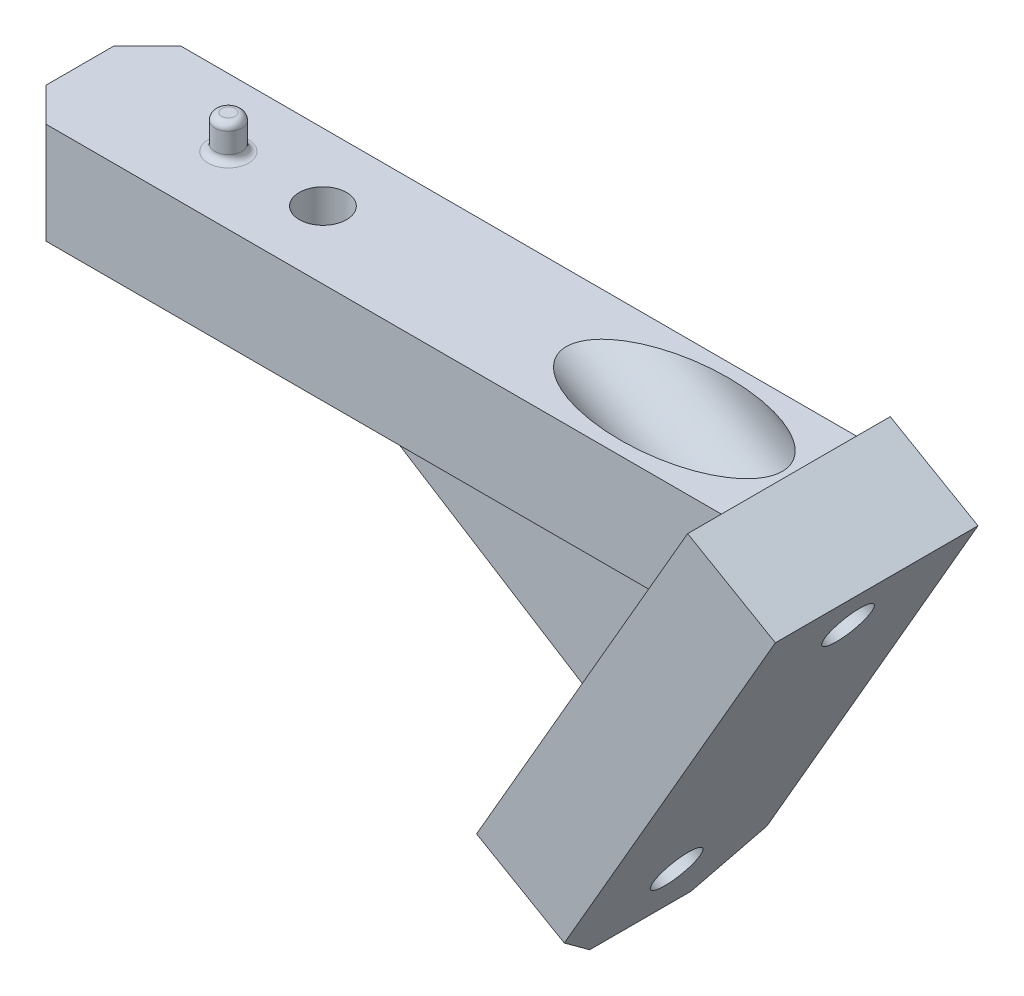
ISO-10303-21;
HEADER;
FILE_DESCRIPTION(('STEP AP214'),'2;1');
FILE_NAME('part.step','',(''),(''),'','','');
FILE_SCHEMA(('AUTOMOTIVE_DESIGN { 1 0 10303 214 1 1 1 1 }'));
ENDSEC;
DATA;
#1=APPLICATION_CONTEXT('core data for automotive mechanical design processes');
#2=APPLICATION_PROTOCOL_DEFINITION('international standard','automotive_design',2000,#1);
#3=PRODUCT_CONTEXT('',#1,'mechanical');
#4=PRODUCT('Part','Part','',(#3));
#5=PRODUCT_RELATED_PRODUCT_CATEGORY('part','',(#4));
#6=PRODUCT_DEFINITION_FORMATION('','',#4);
#7=PRODUCT_DEFINITION_CONTEXT('part definition',#1,'design');
#8=PRODUCT_DEFINITION('design','',#6,#7);
#9=PRODUCT_DEFINITION_SHAPE('','',#8);
#10=(LENGTH_UNIT() NAMED_UNIT(*) SI_UNIT(.MILLI.,.METRE.));
#11=(NAMED_UNIT(*) PLANE_ANGLE_UNIT() SI_UNIT($,.RADIAN.));
#12=(NAMED_UNIT(*) SI_UNIT($,.STERADIAN.) SOLID_ANGLE_UNIT());
#13=UNCERTAINTY_MEASURE_WITH_UNIT(LENGTH_MEASURE(1.E-05),#10,'distance_accuracy_value','');
#14=(GEOMETRIC_REPRESENTATION_CONTEXT(3) GLOBAL_UNCERTAINTY_ASSIGNED_CONTEXT((#13)) GLOBAL_UNIT_ASSIGNED_CONTEXT((#10,
#11,#12)) REPRESENTATION_CONTEXT('',''));
#15=CARTESIAN_POINT('',(0.,0.,0.));
#16=DIRECTION('',(0.,0.,1.));
#17=DIRECTION('',(1.,0.,0.));
#18=AXIS2_PLACEMENT_3D('',#15,#16,#17);
#19=CARTESIAN_POINT('',(65.4903810567666,7.49999999999999,-15.));
#20=DIRECTION('',(0.500000000000001,0.866025403784438,0.));
#21=DIRECTION('',(-0.866025403784438,0.500000000000001,0.));
#22=AXIS2_PLACEMENT_3D('',#19,#20,#21);
#23=PLANE('',#22);
#24=DIRECTION('',(0.,0.,1.));
#25=VECTOR('',#24,1.);
#26=CARTESIAN_POINT('',(52.5,15.,-15.));
#27=LINE('',#26,#25);
#28=CARTESIAN_POINT('',(52.5,15.,-15.));
#29=VERTEX_POINT('',#28);
#30=CARTESIAN_POINT('',(52.5,15.,15.));
#31=VERTEX_POINT('',#30);
#32=EDGE_CURVE('E102',#29,#31,#27,.T.);
#33=ORIENTED_EDGE('',*,*,#32,.T.);
#34=DIRECTION('',(-0.866025403784438,0.500000000000001,0.));
#35=VECTOR('',#34,1.);
#36=CARTESIAN_POINT('',(65.4903810567666,7.49999999999999,15.));
#37=LINE('',#36,#35);
#38=CARTESIAN_POINT('',(65.4903810567666,7.49999999999999,15.));
#39=VERTEX_POINT('',#38);
#40=EDGE_CURVE('E106',#39,#31,#37,.T.);
#41=ORIENTED_EDGE('',*,*,#40,.F.);
#42=DIRECTION('',(0.,0.,1.));
#43=VECTOR('',#42,1.);
#44=CARTESIAN_POINT('',(65.4903810567666,7.49999999999999,-15.));
#45=LINE('',#44,#43);
#46=CARTESIAN_POINT('',(65.4903810567666,7.49999999999999,-15.));
#47=VERTEX_POINT('',#46);
#48=EDGE_CURVE('E137',#47,#39,#45,.T.);
#49=ORIENTED_EDGE('',*,*,#48,.F.);
#50=DIRECTION('',(-0.866025403784438,0.500000000000001,0.));
#51=VECTOR('',#50,1.);
#52=CARTESIAN_POINT('',(65.4903810567666,7.49999999999999,-15.));
#53=LINE('',#52,#51);
#54=EDGE_CURVE('E108',#47,#29,#53,.T.);
#55=ORIENTED_EDGE('',*,*,#54,.T.);
#56=EDGE_LOOP('',(#33,#41,#49,#55));
#57=FACE_BOUND('',#56,.T.);
#58=ADVANCED_FACE('F45',(#57),#23,.T.);
#59=CARTESIAN_POINT('',(30.4903810567665,-53.1217782649107,-15.));
#60=DIRECTION('',(0.866025403784438,-0.500000000000001,0.));
#61=DIRECTION('',(0.500000000000001,0.866025403784438,0.));
#62=AXIS2_PLACEMENT_3D('',#59,#60,#61);
#63=PLANE('',#62);
#64=CARTESIAN_POINT('',(61.2485580837833,0.152947094080046,0.));
#65=DIRECTION('',(0.866025403784438,-0.500000000000001,0.));
#66=DIRECTION('',(0.500000000000001,0.866025403784438,0.));
#67=AXIS2_PLACEMENT_3D('',#64,#65,#66);
#68=CIRCLE('',#67,3.5);
#69=CARTESIAN_POINT('',(62.9985580837833,3.18403600732558,0.));
#70=VERTEX_POINT('',#69);
#71=EDGE_CURVE('E204',#70,#70,#68,.T.);
#72=ORIENTED_EDGE('',*,*,#71,.F.);
#73=EDGE_LOOP('',(#72));
#74=FACE_BOUND('',#73,.T.);
#75=CARTESIAN_POINT('',(35.8701905283832,-43.8036749250303,0.));
#76=DIRECTION('',(0.866025403784438,-0.500000000000001,0.));
#77=DIRECTION('',(0.500000000000001,0.866025403784438,0.));
#78=AXIS2_PLACEMENT_3D('',#75,#76,#77);
#79=CIRCLE('',#78,3.5);
#80=CARTESIAN_POINT('',(37.6201905283832,-40.7725860117848,0.));
#81=VERTEX_POINT('',#80);
#82=EDGE_CURVE('E125',#81,#81,#79,.T.);
#83=ORIENTED_EDGE('',*,*,#82,.F.);
#84=EDGE_LOOP('',(#83));
#85=FACE_BOUND('',#84,.T.);
#86=DIRECTION('',(0.500000000000001,0.866025403784438,0.));
#87=VECTOR('',#86,1.);
#88=CARTESIAN_POINT('',(30.4903810567665,-53.1217782649107,15.));
#89=LINE('',#88,#87);
#90=CARTESIAN_POINT('',(34.2403810567665,-46.6265877365274,15.));
#91=VERTEX_POINT('',#90);
#92=EDGE_CURVE('E120',#91,#39,#89,.T.);
#93=ORIENTED_EDGE('',*,*,#92,.F.);
#94=DIRECTION('',(0.353553390593274,0.612372435695793,0.707106781186548));
#95=VECTOR('',#94,1.);
#96=CARTESIAN_POINT('',(24.8653810567665,-62.8645640574856,-3.75000000000002));
#97=LINE('',#96,#95);
#98=CARTESIAN_POINT('',(30.4903810567665,-53.1217782649107,7.50000000000001));
#99=VERTEX_POINT('',#98);
#100=EDGE_CURVE('E146',#91,#99,#97,.F.);
#101=ORIENTED_EDGE('',*,*,#100,.T.);
#102=DIRECTION('',(0.,0.,1.));
#103=VECTOR('',#102,1.);
#104=CARTESIAN_POINT('',(30.4903810567665,-53.1217782649107,-15.));
#105=LINE('',#104,#103);
#106=CARTESIAN_POINT('',(30.4903810567665,-53.1217782649107,-7.49999999999998));
#107=VERTEX_POINT('',#106);
#108=EDGE_CURVE('E140',#107,#99,#105,.T.);
#109=ORIENTED_EDGE('',*,*,#108,.F.);
#110=DIRECTION('',(0.353553390593275,0.612372435695796,-0.707106781186546));
#111=VECTOR('',#110,1.);
#112=CARTESIAN_POINT('',(32.3653810567665,-49.874183000719,-11.25));
#113=LINE('',#112,#111);
#114=CARTESIAN_POINT('',(34.2403810567666,-46.6265877365274,-15.));
#115=VERTEX_POINT('',#114);
#116=EDGE_CURVE('E144',#107,#115,#113,.T.);
#117=ORIENTED_EDGE('',*,*,#116,.T.);
#118=DIRECTION('',(0.500000000000001,0.866025403784438,0.));
#119=VECTOR('',#118,1.);
#120=CARTESIAN_POINT('',(30.4903810567665,-53.1217782649107,-15.));
#121=LINE('',#120,#119);
#122=EDGE_CURVE('E111',#115,#47,#121,.T.);
#123=ORIENTED_EDGE('',*,*,#122,.T.);
#124=ORIENTED_EDGE('',*,*,#48,.T.);
#125=EDGE_LOOP('',(#93,#101,#109,#117,#123,#124));
#126=FACE_BOUND('',#125,.T.);
#127=ADVANCED_FACE('F160',(#74,#85,#126),#63,.T.);
#128=CARTESIAN_POINT('',(17.4999999999999,-45.6217782649107,-15.));
#129=DIRECTION('',(-0.500000000000001,-0.866025403784438,0.));
#130=DIRECTION('',(0.866025403784438,-0.500000000000001,0.));
#131=AXIS2_PLACEMENT_3D('',#128,#129,#130);
#132=PLANE('',#131);
#133=ORIENTED_EDGE('',*,*,#108,.T.);
#134=DIRECTION('',(-0.866025403784438,0.500000000000001,0.));
#135=VECTOR('',#134,1.);
#136=CARTESIAN_POINT('',(17.4999999999999,-45.6217782649107,7.50000000000001));
#137=LINE('',#136,#135);
#138=CARTESIAN_POINT('',(17.4999999999999,-45.6217782649107,7.50000000000001));
#139=VERTEX_POINT('',#138);
#140=EDGE_CURVE('E68',#99,#139,#137,.T.);
#141=ORIENTED_EDGE('',*,*,#140,.T.);
#142=DIRECTION('',(0.,0.,1.));
#143=VECTOR('',#142,1.);
#144=CARTESIAN_POINT('',(17.4999999999999,-45.6217782649107,-15.));
#145=LINE('',#144,#143);
#146=CARTESIAN_POINT('',(17.4999999999999,-45.6217782649107,-7.49999999999998));
#147=VERTEX_POINT('',#146);
#148=EDGE_CURVE('E110',#147,#139,#145,.T.);
#149=ORIENTED_EDGE('',*,*,#148,.F.);
#150=DIRECTION('',(0.866025403784438,-0.500000000000001,0.));
#151=VECTOR('',#150,1.);
#152=CARTESIAN_POINT('',(30.4903810567665,-53.1217782649107,-7.49999999999998));
#153=LINE('',#152,#151);
#154=EDGE_CURVE('E148',#147,#107,#153,.T.);
#155=ORIENTED_EDGE('',*,*,#154,.T.);
#156=EDGE_LOOP('',(#133,#141,#149,#155));
#157=FACE_BOUND('',#156,.T.);
#158=ADVANCED_FACE('F157',(#157),#132,.T.);
#159=CARTESIAN_POINT('',(52.5,15.,-15.));
#160=DIRECTION('',(-0.866025403784438,0.500000000000001,0.));
#161=DIRECTION('',(-0.500000000000001,-0.866025403784438,0.));
#162=AXIS2_PLACEMENT_3D('',#159,#160,#161);
#163=PLANE('',#162);
#164=CARTESIAN_POINT('',(48.2581770270167,7.65294709408006,0.));
#165=DIRECTION('',(-0.866025403784438,0.500000000000001,0.));
#166=DIRECTION('',(-0.500000000000001,-0.866025403784438,0.));
#167=AXIS2_PLACEMENT_3D('',#164,#165,#166);
#168=CIRCLE('',#167,3.5);
#169=CARTESIAN_POINT('',(46.5081770270167,4.62185818083453,0.));
#170=VERTEX_POINT('',#169);
#171=EDGE_CURVE('E50',#170,#170,#168,.T.);
#172=ORIENTED_EDGE('',*,*,#171,.F.);
#173=EDGE_LOOP('',(#172));
#174=FACE_BOUND('',#173,.T.);
#175=CARTESIAN_POINT('',(22.8798094716166,-36.3036749250303,0.));
#176=DIRECTION('',(-0.866025403784438,0.500000000000001,0.));
#177=DIRECTION('',(-0.500000000000001,-0.866025403784438,0.));
#178=AXIS2_PLACEMENT_3D('',#175,#176,#177);
#179=CIRCLE('',#178,3.5);
#180=CARTESIAN_POINT('',(21.1298094716166,-39.3347638382758,0.));
#181=VERTEX_POINT('',#180);
#182=EDGE_CURVE('E128',#181,#181,#179,.T.);
#183=ORIENTED_EDGE('',*,*,#182,.F.);
#184=EDGE_LOOP('',(#183));
#185=FACE_BOUND('',#184,.T.);
#186=ORIENTED_EDGE('',*,*,#148,.T.);
#187=DIRECTION('',(-0.353553390593274,-0.612372435695793,-0.707106781186548));
#188=VECTOR('',#187,1.);
#189=CARTESIAN_POINT('',(29.3749999999999,-25.0536749250303,31.25));
#190=LINE('',#189,#188);
#191=CARTESIAN_POINT('',(21.2499999999999,-39.1265877365274,15.));
#192=VERTEX_POINT('',#191);
#193=EDGE_CURVE('E55',#139,#192,#190,.F.);
#194=ORIENTED_EDGE('',*,*,#193,.T.);
#195=DIRECTION('',(-0.500000000000001,-0.866025403784438,0.));
#196=VECTOR('',#195,1.);
#197=CARTESIAN_POINT('',(52.5,15.,15.));
#198=LINE('',#197,#196);
#199=EDGE_CURVE('E114',#31,#192,#198,.T.);
#200=ORIENTED_EDGE('',*,*,#199,.F.);
#201=ORIENTED_EDGE('',*,*,#32,.F.);
#202=DIRECTION('',(-0.500000000000001,-0.866025403784438,0.));
#203=VECTOR('',#202,1.);
#204=CARTESIAN_POINT('',(52.5,15.,-15.));
#205=LINE('',#204,#203);
#206=CARTESIAN_POINT('',(21.25,-39.1265877365273,-15.));
#207=VERTEX_POINT('',#206);
#208=EDGE_CURVE('E134',#29,#207,#205,.T.);
#209=ORIENTED_EDGE('',*,*,#208,.T.);
#210=DIRECTION('',(-0.353553390593275,-0.612372435695795,0.707106781186546));
#211=VECTOR('',#210,1.);
#212=CARTESIAN_POINT('',(36.8750000000001,-12.0632938682636,-46.25));
#213=LINE('',#212,#211);
#214=EDGE_CURVE('E152',#207,#147,#213,.T.);
#215=ORIENTED_EDGE('',*,*,#214,.T.);
#216=EDGE_LOOP('',(#186,#194,#200,#201,#209,#215));
#217=FACE_BOUND('',#216,.T.);
#218=ADVANCED_FACE('F115',(#174,#185,#217),#163,.T.);
#219=CARTESIAN_POINT('',(0.,0.,-15.));
#220=DIRECTION('',(0.,0.,1.));
#221=DIRECTION('',(1.,0.,0.));
#222=AXIS2_PLACEMENT_3D('',#219,#220,#221);
#223=PLANE('',#222);
#224=ORIENTED_EDGE('',*,*,#122,.F.);
#225=DIRECTION('',(-0.866025403784438,0.500000000000001,0.));
#226=VECTOR('',#225,1.);
#227=CARTESIAN_POINT('',(21.25,-39.1265877365273,-15.));
#228=LINE('',#227,#226);
#229=EDGE_CURVE('E12',#115,#207,#228,.T.);
#230=ORIENTED_EDGE('',*,*,#229,.T.);
#231=ORIENTED_EDGE('',*,*,#208,.F.);
#232=ORIENTED_EDGE('',*,*,#54,.F.);
#233=EDGE_LOOP('',(#224,#230,#231,#232));
#234=FACE_BOUND('',#233,.T.);
#235=ADVANCED_FACE('F161',(#234),#223,.F.);
#236=CARTESIAN_POINT('',(0.,0.,15.));
#237=DIRECTION('',(0.,0.,1.));
#238=DIRECTION('',(1.,0.,0.));
#239=AXIS2_PLACEMENT_3D('',#236,#237,#238);
#240=PLANE('',#239);
#241=ORIENTED_EDGE('',*,*,#199,.T.);
#242=DIRECTION('',(0.866025403784438,-0.500000000000001,0.));
#243=VECTOR('',#242,1.);
#244=CARTESIAN_POINT('',(-11.6298094716167,-20.1434208871859,15.));
#245=LINE('',#244,#243);
#246=EDGE_CURVE('E139',#192,#91,#245,.T.);
#247=ORIENTED_EDGE('',*,*,#246,.T.);
#248=ORIENTED_EDGE('',*,*,#92,.T.);
#249=ORIENTED_EDGE('',*,*,#40,.T.);
#250=EDGE_LOOP('',(#241,#247,#248,#249));
#251=FACE_BOUND('',#250,.T.);
#252=ADVANCED_FACE('F122',(#251),#240,.T.);
#253=CARTESIAN_POINT('',(62.1201905283832,-58.959119491258,0.));
#254=DIRECTION('',(-0.866025403784438,0.500000000000001,0.));
#255=DIRECTION('',(-0.500000000000001,-0.866025403784438,0.));
#256=AXIS2_PLACEMENT_3D('',#253,#254,#255);
#257=CYLINDRICAL_SURFACE('',#256,3.5);
#258=ORIENTED_EDGE('',*,*,#82,.T.);
#259=EDGE_LOOP('',(#258));
#260=FACE_BOUND('',#259,.T.);
#261=ORIENTED_EDGE('',*,*,#182,.T.);
#262=EDGE_LOOP('',(#261));
#263=FACE_BOUND('',#262,.T.);
#264=ADVANCED_FACE('F168',(#260,#263),#257,.F.);
#265=CARTESIAN_POINT('',(-11.6298094716167,-20.1434208871859,15.));
#266=DIRECTION('',(0.353553390593275,0.612372435695795,-0.707106781186547));
#267=DIRECTION('',(0.866025403784438,-0.500000000000001,0.));
#268=AXIS2_PLACEMENT_3D('',#265,#266,#267);
#269=PLANE('',#268);
#270=ORIENTED_EDGE('',*,*,#193,.F.);
#271=ORIENTED_EDGE('',*,*,#140,.F.);
#272=ORIENTED_EDGE('',*,*,#100,.F.);
#273=ORIENTED_EDGE('',*,*,#246,.F.);
#274=EDGE_LOOP('',(#270,#271,#272,#273));
#275=FACE_BOUND('',#274,.T.);
#276=ADVANCED_FACE('F181',(#275),#269,.F.);
#277=CARTESIAN_POINT('',(17.4999999999999,-45.6217782649107,-7.49999999999998));
#278=DIRECTION('',(-0.353553390593274,-0.612372435695793,-0.707106781186549));
#279=DIRECTION('',(-0.866025403784438,0.500000000000001,0.));
#280=AXIS2_PLACEMENT_3D('',#277,#278,#279);
#281=PLANE('',#280);
#282=ORIENTED_EDGE('',*,*,#214,.F.);
#283=ORIENTED_EDGE('',*,*,#229,.F.);
#284=ORIENTED_EDGE('',*,*,#116,.F.);
#285=ORIENTED_EDGE('',*,*,#154,.F.);
#286=EDGE_LOOP('',(#282,#283,#284,#285));
#287=FACE_BOUND('',#286,.T.);
#288=ADVANCED_FACE('F48',(#287),#281,.T.);
#289=CARTESIAN_POINT('',(87.4985580837833,-15.0024974721477,0.));
#290=DIRECTION('',(-0.866025403784438,0.500000000000001,0.));
#291=DIRECTION('',(-0.500000000000001,-0.866025403784438,0.));
#292=AXIS2_PLACEMENT_3D('',#289,#290,#291);
#293=CYLINDRICAL_SURFACE('',#292,3.5);
#294=ORIENTED_EDGE('',*,*,#71,.T.);
#295=EDGE_LOOP('',(#294));
#296=FACE_BOUND('',#295,.T.);
#297=ORIENTED_EDGE('',*,*,#171,.T.);
#298=EDGE_LOOP('',(#297));
#299=FACE_BOUND('',#298,.T.);
#300=ADVANCED_FACE('F190',(#296,#299),#293,.F.);
#301=CLOSED_SHELL('',(#58,#127,#158,#218,#235,#252,#264,#276,#288,#300));
#302=MANIFOLD_SOLID_BREP('B2',#301);
#303=CARTESIAN_POINT('',(87.4985580837833,-15.0024974721477,0.));
#304=DIRECTION('',(-0.866025403784438,0.500000000000001,0.));
#305=DIRECTION('',(-0.500000000000001,-0.866025403784438,0.));
#306=AXIS2_PLACEMENT_3D('',#303,#304,#305);
#307=CYLINDRICAL_SURFACE('',#306,3.5);
#308=CARTESIAN_POINT('',(52.5,5.20392945877341,0.));
#309=DIRECTION('',(1.,0.,0.));
#310=DIRECTION('',(0.,1.,0.));
#311=AXIS2_PLACEMENT_3D('',#308,#309,#310);
#312=ELLIPSE('',#311,4.04145188432738,3.5);
#313=CARTESIAN_POINT('',(52.5,9.24538134310079,0.));
#314=VERTEX_POINT('',#313);
#315=EDGE_CURVE('E364',#314,#314,#312,.T.);
#316=ORIENTED_EDGE('',*,*,#315,.T.);
#317=EDGE_LOOP('',(#316));
#318=FACE_BOUND('',#317,.T.);
#319=CARTESIAN_POINT('',(48.2581770270167,7.65294709408007,0.));
#320=DIRECTION('',(-0.866025403784438,0.500000000000001,0.));
#321=DIRECTION('',(-0.500000000000001,-0.866025403784438,0.));
#322=AXIS2_PLACEMENT_3D('',#319,#320,#321);
#323=CIRCLE('',#322,3.5);
#324=CARTESIAN_POINT('',(46.5081770270167,4.62185818083453,0.));
#325=VERTEX_POINT('',#324);
#326=EDGE_CURVE('E436',#325,#325,#323,.F.);
#327=ORIENTED_EDGE('',*,*,#326,.F.);
#328=EDGE_LOOP('',(#327));
#329=FACE_BOUND('',#328,.T.);
#330=ADVANCED_FACE('F269',(#318,#329),#307,.F.);
#331=CARTESIAN_POINT('',(0.,0.,0.));
#332=DIRECTION('',(0.,1.,0.));
#333=DIRECTION('',(0.,0.,1.));
#334=AXIS2_PLACEMENT_3D('',#331,#332,#333);
#335=PLANE('',#334);
#336=CARTESIAN_POINT('',(-16.5,0.,0.));
#337=DIRECTION('',(0.,1.,0.));
#338=DIRECTION('',(0.,0.,1.));
#339=AXIS2_PLACEMENT_3D('',#336,#337,#338);
#340=CIRCLE('',#339,6.99999999999999);
#341=CARTESIAN_POINT('',(-16.5,0.,6.99999999999999));
#342=VERTEX_POINT('',#341);
#343=EDGE_CURVE('E422',#342,#342,#340,.T.);
#344=ORIENTED_EDGE('',*,*,#343,.T.);
#345=EDGE_LOOP('',(#344));
#346=FACE_BOUND('',#345,.T.);
#347=DIRECTION('',(0.,0.,1.));
#348=VECTOR('',#347,1.);
#349=CARTESIAN_POINT('',(-52.5,0.,-10.));
#350=LINE('',#349,#348);
#351=CARTESIAN_POINT('',(-52.5,0.,-5.00000000000001));
#352=VERTEX_POINT('',#351);
#353=CARTESIAN_POINT('',(-52.5,0.,4.99999999999999));
#354=VERTEX_POINT('',#353);
#355=EDGE_CURVE('E380',#352,#354,#350,.T.);
#356=ORIENTED_EDGE('',*,*,#355,.F.);
#357=DIRECTION('',(0.707106781186549,0.,-0.707106781186547));
#358=VECTOR('',#357,1.);
#359=CARTESIAN_POINT('',(-52.5,0.,-5.00000000000001));
#360=LINE('',#359,#358);
#361=CARTESIAN_POINT('',(-47.5,0.,-10.));
#362=VERTEX_POINT('',#361);
#363=EDGE_CURVE('E432',#352,#362,#360,.T.);
#364=ORIENTED_EDGE('',*,*,#363,.T.);
#365=DIRECTION('',(1.,0.,0.));
#366=VECTOR('',#365,1.);
#367=CARTESIAN_POINT('',(-52.5,0.,-10.));
#368=LINE('',#367,#366);
#369=CARTESIAN_POINT('',(52.5,0.,-10.));
#370=VERTEX_POINT('',#369);
#371=EDGE_CURVE('E384',#362,#370,#368,.T.);
#372=ORIENTED_EDGE('',*,*,#371,.T.);
#373=DIRECTION('',(0.,0.,1.));
#374=VECTOR('',#373,1.);
#375=CARTESIAN_POINT('',(52.5,0.,-10.));
#376=LINE('',#375,#374);
#377=CARTESIAN_POINT('',(52.5,0.,10.));
#378=VERTEX_POINT('',#377);
#379=EDGE_CURVE('E396',#370,#378,#376,.T.);
#380=ORIENTED_EDGE('',*,*,#379,.T.);
#381=DIRECTION('',(1.,0.,0.));
#382=VECTOR('',#381,1.);
#383=CARTESIAN_POINT('',(-52.5,0.,10.));
#384=LINE('',#383,#382);
#385=CARTESIAN_POINT('',(-47.5,0.,10.));
#386=VERTEX_POINT('',#385);
#387=EDGE_CURVE('E394',#386,#378,#384,.T.);
#388=ORIENTED_EDGE('',*,*,#387,.F.);
#389=DIRECTION('',(0.707106781186547,0.,0.707106781186549));
#390=VECTOR('',#389,1.);
#391=CARTESIAN_POINT('',(-47.5,0.,10.));
#392=LINE('',#391,#390);
#393=EDGE_CURVE('E430',#386,#354,#392,.F.);
#394=ORIENTED_EDGE('',*,*,#393,.T.);
#395=EDGE_LOOP('',(#356,#364,#372,#380,#388,#394));
#396=FACE_BOUND('',#395,.T.);
#397=DIRECTION('',(1.,0.,0.));
#398=VECTOR('',#397,1.);
#399=CARTESIAN_POINT('',(-8.08391123701702,0.,-5.));
#400=LINE('',#399,#398);
#401=CARTESIAN_POINT('',(-8.08391123701702,0.,-5.));
#402=VERTEX_POINT('',#401);
#403=CARTESIAN_POINT('',(43.8397459621556,0.,-5.));
#404=VERTEX_POINT('',#403);
#405=EDGE_CURVE('E367',#402,#404,#400,.T.);
#406=ORIENTED_EDGE('',*,*,#405,.F.);
#407=DIRECTION('',(0.,0.,1.));
#408=VECTOR('',#407,1.);
#409=CARTESIAN_POINT('',(-8.08391123701702,0.,-5.));
#410=LINE('',#409,#408);
#411=CARTESIAN_POINT('',(-8.08391123701702,0.,5.));
#412=VERTEX_POINT('',#411);
#413=EDGE_CURVE('E360',#402,#412,#410,.T.);
#414=ORIENTED_EDGE('',*,*,#413,.T.);
#415=DIRECTION('',(1.,0.,0.));
#416=VECTOR('',#415,1.);
#417=CARTESIAN_POINT('',(-8.08391123701702,0.,5.));
#418=LINE('',#417,#416);
#419=CARTESIAN_POINT('',(43.8397459621556,0.,5.));
#420=VERTEX_POINT('',#419);
#421=EDGE_CURVE('E345',#412,#420,#418,.T.);
#422=ORIENTED_EDGE('',*,*,#421,.T.);
#423=DIRECTION('',(0.,0.,1.));
#424=VECTOR('',#423,1.);
#425=CARTESIAN_POINT('',(43.8397459621556,0.,-5.));
#426=LINE('',#425,#424);
#427=EDGE_CURVE('E369',#404,#420,#426,.T.);
#428=ORIENTED_EDGE('',*,*,#427,.F.);
#429=EDGE_LOOP('',(#406,#414,#422,#428));
#430=FACE_BOUND('',#429,.T.);
#431=ADVANCED_FACE('F366',(#346,#396,#430),#335,.F.);
#432=CARTESIAN_POINT('',(-16.5,0.,0.));
#433=DIRECTION('',(0.,1.,0.));
#434=DIRECTION('',(0.,0.,1.));
#435=AXIS2_PLACEMENT_3D('',#432,#433,#434);
#436=CYLINDRICAL_SURFACE('',#435,3.5);
#437=CARTESIAN_POINT('',(-16.5,15.,0.));
#438=DIRECTION('',(0.,1.,0.));
#439=DIRECTION('',(0.,0.,1.));
#440=AXIS2_PLACEMENT_3D('',#437,#438,#439);
#441=CIRCLE('',#440,3.5);
#442=CARTESIAN_POINT('',(-16.5,15.,3.5));
#443=VERTEX_POINT('',#442);
#444=EDGE_CURVE('E377',#443,#443,#441,.T.);
#445=ORIENTED_EDGE('',*,*,#444,.T.);
#446=EDGE_LOOP('',(#445));
#447=FACE_BOUND('',#446,.T.);
#448=CARTESIAN_POINT('',(-16.5,8.,0.));
#449=DIRECTION('',(0.,-1.,0.));
#450=DIRECTION('',(0.,0.,-1.));
#451=AXIS2_PLACEMENT_3D('',#448,#449,#450);
#452=CIRCLE('',#451,3.5);
#453=CARTESIAN_POINT('',(-16.5,8.,-3.5));
#454=VERTEX_POINT('',#453);
#455=EDGE_CURVE('E372',#454,#454,#452,.F.);
#456=ORIENTED_EDGE('',*,*,#455,.F.);
#457=EDGE_LOOP('',(#456));
#458=FACE_BOUND('',#457,.T.);
#459=ADVANCED_FACE('F474',(#447,#458),#436,.F.);
#460=CARTESIAN_POINT('',(-52.5,15.,-10.));
#461=DIRECTION('',(1.,0.,0.));
#462=DIRECTION('',(0.,0.,-1.));
#463=AXIS2_PLACEMENT_3D('',#460,#461,#462);
#464=PLANE('',#463);
#465=DIRECTION('',(0.,0.,1.));
#466=VECTOR('',#465,1.);
#467=CARTESIAN_POINT('',(-52.5,15.,-10.));
#468=LINE('',#467,#466);
#469=CARTESIAN_POINT('',(-52.5,15.,-5.00000000000001));
#470=VERTEX_POINT('',#469);
#471=CARTESIAN_POINT('',(-52.5,15.,4.99999999999999));
#472=VERTEX_POINT('',#471);
#473=EDGE_CURVE('E381',#470,#472,#468,.T.);
#474=ORIENTED_EDGE('',*,*,#473,.F.);
#475=DIRECTION('',(0.,-1.,0.));
#476=VECTOR('',#475,1.);
#477=CARTESIAN_POINT('',(-52.5,0.,-5.00000000000001));
#478=LINE('',#477,#476);
#479=EDGE_CURVE('E427',#470,#352,#478,.T.);
#480=ORIENTED_EDGE('',*,*,#479,.T.);
#481=ORIENTED_EDGE('',*,*,#355,.T.);
#482=DIRECTION('',(0.,1.,0.));
#483=VECTOR('',#482,1.);
#484=CARTESIAN_POINT('',(-52.5,15.,4.99999999999999));
#485=LINE('',#484,#483);
#486=EDGE_CURVE('E425',#354,#472,#485,.T.);
#487=ORIENTED_EDGE('',*,*,#486,.T.);
#488=EDGE_LOOP('',(#474,#480,#481,#487));
#489=FACE_BOUND('',#488,.T.);
#490=ADVANCED_FACE('F499',(#489),#464,.F.);
#491=CARTESIAN_POINT('',(-52.5,15.,10.));
#492=DIRECTION('',(0.,0.,-1.));
#493=DIRECTION('',(-1.,0.,0.));
#494=AXIS2_PLACEMENT_3D('',#491,#492,#493);
#495=PLANE('',#494);
#496=DIRECTION('',(1.,0.,0.));
#497=VECTOR('',#496,1.);
#498=CARTESIAN_POINT('',(-52.5,15.,10.));
#499=LINE('',#498,#497);
#500=CARTESIAN_POINT('',(-47.5,15.,10.));
#501=VERTEX_POINT('',#500);
#502=CARTESIAN_POINT('',(52.5,15.,10.));
#503=VERTEX_POINT('',#502);
#504=EDGE_CURVE('E383',#501,#503,#499,.T.);
#505=ORIENTED_EDGE('',*,*,#504,.F.);
#506=DIRECTION('',(0.,-1.,0.));
#507=VECTOR('',#506,1.);
#508=CARTESIAN_POINT('',(-47.5,15.,10.));
#509=LINE('',#508,#507);
#510=EDGE_CURVE('E43',#501,#386,#509,.T.);
#511=ORIENTED_EDGE('',*,*,#510,.T.);
#512=ORIENTED_EDGE('',*,*,#387,.T.);
#513=DIRECTION('',(0.,-1.,0.));
#514=VECTOR('',#513,1.);
#515=CARTESIAN_POINT('',(52.5,15.,10.));
#516=LINE('',#515,#514);
#517=EDGE_CURVE('E402',#503,#378,#516,.T.);
#518=ORIENTED_EDGE('',*,*,#517,.F.);
#519=EDGE_LOOP('',(#505,#511,#512,#518));
#520=FACE_BOUND('',#519,.T.);
#521=ADVANCED_FACE('F529',(#520),#495,.F.);
#522=CARTESIAN_POINT('',(52.5,15.,-10.));
#523=DIRECTION('',(1.,0.,0.));
#524=DIRECTION('',(0.,0.,-1.));
#525=AXIS2_PLACEMENT_3D('',#522,#523,#524);
#526=PLANE('',#525);
#527=ORIENTED_EDGE('',*,*,#315,.F.);
#528=EDGE_LOOP('',(#527));
#529=FACE_BOUND('',#528,.T.);
#530=ORIENTED_EDGE('',*,*,#379,.F.);
#531=DIRECTION('',(0.,-1.,0.));
#532=VECTOR('',#531,1.);
#533=CARTESIAN_POINT('',(52.5,15.,-10.));
#534=LINE('',#533,#532);
#535=CARTESIAN_POINT('',(52.5,15.,-10.));
#536=VERTEX_POINT('',#535);
#537=EDGE_CURVE('E391',#536,#370,#534,.T.);
#538=ORIENTED_EDGE('',*,*,#537,.F.);
#539=DIRECTION('',(0.,0.,1.));
#540=VECTOR('',#539,1.);
#541=CARTESIAN_POINT('',(52.5,15.,-10.));
#542=LINE('',#541,#540);
#543=EDGE_CURVE('E386',#536,#503,#542,.T.);
#544=ORIENTED_EDGE('',*,*,#543,.T.);
#545=ORIENTED_EDGE('',*,*,#517,.T.);
#546=EDGE_LOOP('',(#530,#538,#544,#545));
#547=FACE_BOUND('',#546,.T.);
#548=ADVANCED_FACE('F535',(#529,#547),#526,.T.);
#549=CARTESIAN_POINT('',(-52.5,15.,-10.));
#550=DIRECTION('',(0.,0.,-1.));
#551=DIRECTION('',(-1.,0.,0.));
#552=AXIS2_PLACEMENT_3D('',#549,#550,#551);
#553=PLANE('',#552);
#554=ORIENTED_EDGE('',*,*,#371,.F.);
#555=DIRECTION('',(0.,1.,0.));
#556=VECTOR('',#555,1.);
#557=CARTESIAN_POINT('',(-47.5,15.,-10.));
#558=LINE('',#557,#556);
#559=CARTESIAN_POINT('',(-47.5,15.,-10.));
#560=VERTEX_POINT('',#559);
#561=EDGE_CURVE('E295',#362,#560,#558,.T.);
#562=ORIENTED_EDGE('',*,*,#561,.T.);
#563=DIRECTION('',(1.,0.,0.));
#564=VECTOR('',#563,1.);
#565=CARTESIAN_POINT('',(-52.5,15.,-10.));
#566=LINE('',#565,#564);
#567=EDGE_CURVE('E389',#560,#536,#566,.T.);
#568=ORIENTED_EDGE('',*,*,#567,.T.);
#569=ORIENTED_EDGE('',*,*,#537,.T.);
#570=EDGE_LOOP('',(#554,#562,#568,#569));
#571=FACE_BOUND('',#570,.T.);
#572=ADVANCED_FACE('F536',(#571),#553,.T.);
#573=CARTESIAN_POINT('',(0.,15.,0.));
#574=DIRECTION('',(0.,1.,0.));
#575=DIRECTION('',(0.,0.,1.));
#576=AXIS2_PLACEMENT_3D('',#573,#574,#575);
#577=PLANE('',#576);
#578=CARTESIAN_POINT('',(35.5327081080668,15.,0.));
#579=DIRECTION('',(0.,1.,0.));
#580=DIRECTION('',(1.,0.,0.));
#581=AXIS2_PLACEMENT_3D('',#578,#579,#580);
#582=ELLIPSE('',#581,16.,8.);
#583=CARTESIAN_POINT('',(51.5327081080668,15.,0.));
#584=VERTEX_POINT('',#583);
#585=EDGE_CURVE('E274',#584,#584,#582,.F.);
#586=ORIENTED_EDGE('',*,*,#585,.T.);
#587=EDGE_LOOP('',(#586));
#588=FACE_BOUND('',#587,.T.);
#589=CARTESIAN_POINT('',(-30.5,15.,0.));
#590=DIRECTION('',(0.,1.,0.));
#591=DIRECTION('',(0.,0.,1.));
#592=AXIS2_PLACEMENT_3D('',#589,#590,#591);
#593=CIRCLE('',#592,3.);
#594=CARTESIAN_POINT('',(-30.5,15.,3.));
#595=VERTEX_POINT('',#594);
#596=EDGE_CURVE('E416',#595,#595,#593,.F.);
#597=ORIENTED_EDGE('',*,*,#596,.T.);
#598=EDGE_LOOP('',(#597));
#599=FACE_BOUND('',#598,.T.);
#600=ORIENTED_EDGE('',*,*,#444,.F.);
#601=EDGE_LOOP('',(#600));
#602=FACE_BOUND('',#601,.T.);
#603=ORIENTED_EDGE('',*,*,#567,.F.);
#604=DIRECTION('',(-0.707106781186549,0.,0.707106781186547));
#605=VECTOR('',#604,1.);
#606=CARTESIAN_POINT('',(-28.7499999999999,15.,-28.75));
#607=LINE('',#606,#605);
#608=EDGE_CURVE('E279',#560,#470,#607,.T.);
#609=ORIENTED_EDGE('',*,*,#608,.T.);
#610=ORIENTED_EDGE('',*,*,#473,.T.);
#611=DIRECTION('',(-0.707106781186547,0.,-0.707106781186549));
#612=VECTOR('',#611,1.);
#613=CARTESIAN_POINT('',(-28.7500000000001,15.,28.75));
#614=LINE('',#613,#612);
#615=EDGE_CURVE('E287',#472,#501,#614,.F.);
#616=ORIENTED_EDGE('',*,*,#615,.T.);
#617=ORIENTED_EDGE('',*,*,#504,.T.);
#618=ORIENTED_EDGE('',*,*,#543,.F.);
#619=EDGE_LOOP('',(#603,#609,#610,#616,#617,#618));
#620=FACE_BOUND('',#619,.T.);
#621=ADVANCED_FACE('F521',(#588,#599,#602,#620),#577,.T.);
#622=CARTESIAN_POINT('',(-30.5,20.,0.));
#623=DIRECTION('',(0.,-1.,0.));
#624=DIRECTION('',(0.,0.,-1.));
#625=AXIS2_PLACEMENT_3D('',#622,#623,#624);
#626=CYLINDRICAL_SURFACE('',#625,2.);
#627=CARTESIAN_POINT('',(-30.5,16.,0.));
#628=DIRECTION('',(0.,1.,0.));
#629=DIRECTION('',(0.,0.,1.));
#630=AXIS2_PLACEMENT_3D('',#627,#628,#629);
#631=CIRCLE('',#630,2.);
#632=CARTESIAN_POINT('',(-30.5,16.,2.));
#633=VERTEX_POINT('',#632);
#634=EDGE_CURVE('E413',#633,#633,#631,.T.);
#635=ORIENTED_EDGE('',*,*,#634,.T.);
#636=EDGE_LOOP('',(#635));
#637=FACE_BOUND('',#636,.T.);
#638=CARTESIAN_POINT('',(-30.5,19.,0.));
#639=DIRECTION('',(0.,1.,0.));
#640=DIRECTION('',(0.,0.,1.));
#641=AXIS2_PLACEMENT_3D('',#638,#639,#640);
#642=CIRCLE('',#641,2.);
#643=CARTESIAN_POINT('',(-30.5,19.,2.));
#644=VERTEX_POINT('',#643);
#645=EDGE_CURVE('E410',#644,#644,#642,.F.);
#646=ORIENTED_EDGE('',*,*,#645,.T.);
#647=EDGE_LOOP('',(#646));
#648=FACE_BOUND('',#647,.T.);
#649=ADVANCED_FACE('F543',(#637,#648),#626,.T.);
#650=CARTESIAN_POINT('',(-30.5,20.,0.));
#651=DIRECTION('',(0.,1.,0.));
#652=DIRECTION('',(0.,0.,1.));
#653=AXIS2_PLACEMENT_3D('',#650,#651,#652);
#654=PLANE('',#653);
#655=CARTESIAN_POINT('',(-30.5,20.,0.));
#656=DIRECTION('',(0.,1.,0.));
#657=DIRECTION('',(0.,0.,1.));
#658=AXIS2_PLACEMENT_3D('',#655,#656,#657);
#659=CIRCLE('',#658,1.);
#660=CARTESIAN_POINT('',(-30.5,20.,1.));
#661=VERTEX_POINT('',#660);
#662=EDGE_CURVE('E405',#661,#661,#659,.T.);
#663=ORIENTED_EDGE('',*,*,#662,.T.);
#664=EDGE_LOOP('',(#663));
#665=FACE_BOUND('',#664,.T.);
#666=ADVANCED_FACE('F563',(#665),#654,.T.);
#667=CARTESIAN_POINT('',(-16.5,8.,0.));
#668=DIRECTION('',(0.,-1.,0.));
#669=DIRECTION('',(0.,0.,-1.));
#670=AXIS2_PLACEMENT_3D('',#667,#668,#669);
#671=PLANE('',#670);
#672=CARTESIAN_POINT('',(-16.5,8.,0.));
#673=DIRECTION('',(0.,-1.,0.));
#674=DIRECTION('',(0.,0.,-1.));
#675=AXIS2_PLACEMENT_3D('',#672,#673,#674);
#676=CIRCLE('',#675,5.);
#677=CARTESIAN_POINT('',(-16.5,8.,-5.));
#678=VERTEX_POINT('',#677);
#679=EDGE_CURVE('E368',#678,#678,#676,.T.);
#680=ORIENTED_EDGE('',*,*,#679,.T.);
#681=EDGE_LOOP('',(#680));
#682=FACE_BOUND('',#681,.T.);
#683=ORIENTED_EDGE('',*,*,#455,.T.);
#684=EDGE_LOOP('',(#683));
#685=FACE_BOUND('',#684,.T.);
#686=ADVANCED_FACE('F567',(#682,#685),#671,.T.);
#687=CARTESIAN_POINT('',(-16.5,8.,0.));
#688=DIRECTION('',(0.,-1.,0.));
#689=DIRECTION('',(0.,0.,-1.));
#690=AXIS2_PLACEMENT_3D('',#687,#688,#689);
#691=CYLINDRICAL_SURFACE('',#690,5.);
#692=CARTESIAN_POINT('',(-16.5,2.,0.));
#693=DIRECTION('',(0.,1.,0.));
#694=DIRECTION('',(0.,0.,1.));
#695=AXIS2_PLACEMENT_3D('',#692,#693,#694);
#696=CIRCLE('',#695,5.);
#697=CARTESIAN_POINT('',(-16.5,2.,5.));
#698=VERTEX_POINT('',#697);
#699=EDGE_CURVE('E419',#698,#698,#696,.F.);
#700=ORIENTED_EDGE('',*,*,#699,.T.);
#701=EDGE_LOOP('',(#700));
#702=FACE_BOUND('',#701,.T.);
#703=ORIENTED_EDGE('',*,*,#679,.F.);
#704=EDGE_LOOP('',(#703));
#705=FACE_BOUND('',#704,.T.);
#706=ADVANCED_FACE('F466',(#702,#705),#691,.F.);
#707=CARTESIAN_POINT('',(30.,-23.9711431702997,-5.));
#708=DIRECTION('',(0.532692070451105,0.846309138600378,0.));
#709=DIRECTION('',(-0.846309138600378,0.532692070451105,0.));
#710=AXIS2_PLACEMENT_3D('',#707,#708,#709);
#711=PLANE('',#710);
#712=DIRECTION('',(0.,0.,1.));
#713=VECTOR('',#712,1.);
#714=CARTESIAN_POINT('',(30.,-23.9711431702997,-5.));
#715=LINE('',#714,#713);
#716=CARTESIAN_POINT('',(30.,-23.9711431702997,-5.));
#717=VERTEX_POINT('',#716);
#718=CARTESIAN_POINT('',(30.,-23.9711431702997,5.));
#719=VERTEX_POINT('',#718);
#720=EDGE_CURVE('E363',#717,#719,#715,.T.);
#721=ORIENTED_EDGE('',*,*,#720,.T.);
#722=DIRECTION('',(-0.846309138600378,0.532692070451105,0.));
#723=VECTOR('',#722,1.);
#724=CARTESIAN_POINT('',(30.,-23.9711431702997,5.));
#725=LINE('',#724,#723);
#726=EDGE_CURVE('E348',#719,#412,#725,.T.);
#727=ORIENTED_EDGE('',*,*,#726,.T.);
#728=ORIENTED_EDGE('',*,*,#413,.F.);
#729=DIRECTION('',(-0.846309138600378,0.532692070451105,0.));
#730=VECTOR('',#729,1.);
#731=CARTESIAN_POINT('',(30.,-23.9711431702997,-5.));
#732=LINE('',#731,#730);
#733=EDGE_CURVE('E450',#717,#402,#732,.T.);
#734=ORIENTED_EDGE('',*,*,#733,.F.);
#735=EDGE_LOOP('',(#721,#727,#728,#734));
#736=FACE_BOUND('',#735,.T.);
#737=ADVANCED_FACE('F358',(#736),#711,.F.);
#738=CARTESIAN_POINT('',(43.8397459621556,0.,-5.));
#739=DIRECTION('',(-0.866025403784439,0.499999999999999,0.));
#740=DIRECTION('',(-0.499999999999999,-0.866025403784439,0.));
#741=AXIS2_PLACEMENT_3D('',#738,#739,#740);
#742=PLANE('',#741);
#743=ORIENTED_EDGE('',*,*,#427,.T.);
#744=DIRECTION('',(-0.499999999999999,-0.866025403784439,0.));
#745=VECTOR('',#744,1.);
#746=CARTESIAN_POINT('',(43.8397459621556,0.,5.));
#747=LINE('',#746,#745);
#748=EDGE_CURVE('E350',#420,#719,#747,.T.);
#749=ORIENTED_EDGE('',*,*,#748,.T.);
#750=ORIENTED_EDGE('',*,*,#720,.F.);
#751=DIRECTION('',(-0.499999999999999,-0.866025403784439,0.));
#752=VECTOR('',#751,1.);
#753=CARTESIAN_POINT('',(43.8397459621556,0.,-5.));
#754=LINE('',#753,#752);
#755=EDGE_CURVE('E453',#404,#717,#754,.T.);
#756=ORIENTED_EDGE('',*,*,#755,.F.);
#757=EDGE_LOOP('',(#743,#749,#750,#756));
#758=FACE_BOUND('',#757,.T.);
#759=ADVANCED_FACE('F458',(#758),#742,.F.);
#760=CARTESIAN_POINT('',(0.,0.,-5.));
#761=DIRECTION('',(0.,0.,1.));
#762=DIRECTION('',(1.,0.,0.));
#763=AXIS2_PLACEMENT_3D('',#760,#761,#762);
#764=PLANE('',#763);
#765=ORIENTED_EDGE('',*,*,#733,.T.);
#766=ORIENTED_EDGE('',*,*,#405,.T.);
#767=ORIENTED_EDGE('',*,*,#755,.T.);
#768=EDGE_LOOP('',(#765,#766,#767));
#769=FACE_BOUND('',#768,.T.);
#770=ADVANCED_FACE('F456',(#769),#764,.F.);
#771=CARTESIAN_POINT('',(0.,0.,5.));
#772=DIRECTION('',(0.,0.,1.));
#773=DIRECTION('',(1.,0.,0.));
#774=AXIS2_PLACEMENT_3D('',#771,#772,#773);
#775=PLANE('',#774);
#776=ORIENTED_EDGE('',*,*,#726,.F.);
#777=ORIENTED_EDGE('',*,*,#748,.F.);
#778=ORIENTED_EDGE('',*,*,#421,.F.);
#779=EDGE_LOOP('',(#776,#777,#778));
#780=FACE_BOUND('',#779,.T.);
#781=ADVANCED_FACE('F347',(#780),#775,.T.);
#782=CARTESIAN_POINT('',(-30.5,19.,0.));
#783=DIRECTION('',(0.,1.,0.));
#784=DIRECTION('',(0.,0.,1.));
#785=AXIS2_PLACEMENT_3D('',#782,#783,#784);
#786=TOROIDAL_SURFACE('',#785,1.,1.);
#787=ORIENTED_EDGE('',*,*,#645,.F.);
#788=EDGE_LOOP('',(#787));
#789=FACE_BOUND('',#788,.T.);
#790=ORIENTED_EDGE('',*,*,#662,.F.);
#791=EDGE_LOOP('',(#790));
#792=FACE_BOUND('',#791,.T.);
#793=ADVANCED_FACE('F483',(#789,#792),#786,.T.);
#794=CARTESIAN_POINT('',(-30.5,16.,0.));
#795=DIRECTION('',(0.,1.,0.));
#796=DIRECTION('',(0.,0.,1.));
#797=AXIS2_PLACEMENT_3D('',#794,#795,#796);
#798=TOROIDAL_SURFACE('',#797,3.,1.);
#799=ORIENTED_EDGE('',*,*,#596,.F.);
#800=EDGE_LOOP('',(#799));
#801=FACE_BOUND('',#800,.T.);
#802=ORIENTED_EDGE('',*,*,#634,.F.);
#803=EDGE_LOOP('',(#802));
#804=FACE_BOUND('',#803,.T.);
#805=ADVANCED_FACE('F487',(#801,#804),#798,.F.);
#806=CARTESIAN_POINT('',(-16.5,2.,0.));
#807=DIRECTION('',(0.,-1.,0.));
#808=DIRECTION('',(0.,0.,-1.));
#809=AXIS2_PLACEMENT_3D('',#806,#807,#808);
#810=CONICAL_SURFACE('',#809,5.,0.785398163397447);
#811=ORIENTED_EDGE('',*,*,#343,.F.);
#812=EDGE_LOOP('',(#811));
#813=FACE_BOUND('',#812,.T.);
#814=ORIENTED_EDGE('',*,*,#699,.F.);
#815=EDGE_LOOP('',(#814));
#816=FACE_BOUND('',#815,.T.);
#817=ADVANCED_FACE('F493',(#813,#816),#810,.F.);
#818=CARTESIAN_POINT('',(-52.5,15.,-5.00000000000001));
#819=DIRECTION('',(-0.707106781186546,0.,-0.707106781186548));
#820=DIRECTION('',(0.,1.,0.));
#821=AXIS2_PLACEMENT_3D('',#818,#819,#820);
#822=PLANE('',#821);
#823=ORIENTED_EDGE('',*,*,#608,.F.);
#824=ORIENTED_EDGE('',*,*,#561,.F.);
#825=ORIENTED_EDGE('',*,*,#363,.F.);
#826=ORIENTED_EDGE('',*,*,#479,.F.);
#827=EDGE_LOOP('',(#823,#824,#825,#826));
#828=FACE_BOUND('',#827,.T.);
#829=ADVANCED_FACE('F507',(#828),#822,.T.);
#830=CARTESIAN_POINT('',(-47.5,15.,10.));
#831=DIRECTION('',(0.707106781186548,0.,-0.707106781186546));
#832=DIRECTION('',(0.,-1.,0.));
#833=AXIS2_PLACEMENT_3D('',#830,#831,#832);
#834=PLANE('',#833);
#835=ORIENTED_EDGE('',*,*,#615,.F.);
#836=ORIENTED_EDGE('',*,*,#486,.F.);
#837=ORIENTED_EDGE('',*,*,#393,.F.);
#838=ORIENTED_EDGE('',*,*,#510,.F.);
#839=EDGE_LOOP('',(#835,#836,#837,#838));
#840=FACE_BOUND('',#839,.T.);
#841=ADVANCED_FACE('F272',(#840),#834,.F.);
#842=CARTESIAN_POINT('',(48.2581770270167,7.65294709408007,0.));
#843=DIRECTION('',(-0.866025403784438,0.500000000000001,0.));
#844=DIRECTION('',(-0.500000000000001,-0.866025403784438,0.));
#845=AXIS2_PLACEMENT_3D('',#842,#843,#844);
#846=PLANE('',#845);
#847=CARTESIAN_POINT('',(48.2581770270167,7.65294709408007,0.));
#848=DIRECTION('',(-0.866025403784438,0.500000000000001,0.));
#849=DIRECTION('',(-0.500000000000001,-0.866025403784438,0.));
#850=AXIS2_PLACEMENT_3D('',#847,#848,#849);
#851=CIRCLE('',#850,8.);
#852=CARTESIAN_POINT('',(44.2581770270167,0.724743863804562,0.));
#853=VERTEX_POINT('',#852);
#854=EDGE_CURVE('E438',#853,#853,#851,.T.);
#855=ORIENTED_EDGE('',*,*,#854,.T.);
#856=EDGE_LOOP('',(#855));
#857=FACE_BOUND('',#856,.T.);
#858=ORIENTED_EDGE('',*,*,#326,.T.);
#859=EDGE_LOOP('',(#858));
#860=FACE_BOUND('',#859,.T.);
#861=ADVANCED_FACE('F516',(#857,#860),#846,.T.);
#862=CARTESIAN_POINT('',(22.2774149134836,22.6529470940801,0.));
#863=DIRECTION('',(0.866025403784438,-0.500000000000001,0.));
#864=DIRECTION('',(0.500000000000001,0.866025403784438,0.));
#865=AXIS2_PLACEMENT_3D('',#862,#863,#864);
#866=CYLINDRICAL_SURFACE('',#865,8.);
#867=ORIENTED_EDGE('',*,*,#585,.F.);
#868=EDGE_LOOP('',(#867));
#869=FACE_BOUND('',#868,.T.);
#870=ORIENTED_EDGE('',*,*,#854,.F.);
#871=EDGE_LOOP('',(#870));
#872=FACE_BOUND('',#871,.T.);
#873=ADVANCED_FACE('F480',(#869,#872),#866,.F.);
#874=CLOSED_SHELL('',(#330,#431,#459,#490,#521,#548,#572,#621,#649,#666,#686,#706,#737,#759,
#770,#781,#793,#805,#817,#829,#841,#861,#873));
#875=MANIFOLD_SOLID_BREP('B6',#874);
#876=ADVANCED_BREP_SHAPE_REPRESENTATION('',(#18,#302,#875),#14);
#877=SHAPE_DEFINITION_REPRESENTATION(#9,#876);
ENDSEC;
END-ISO-10303-21;
